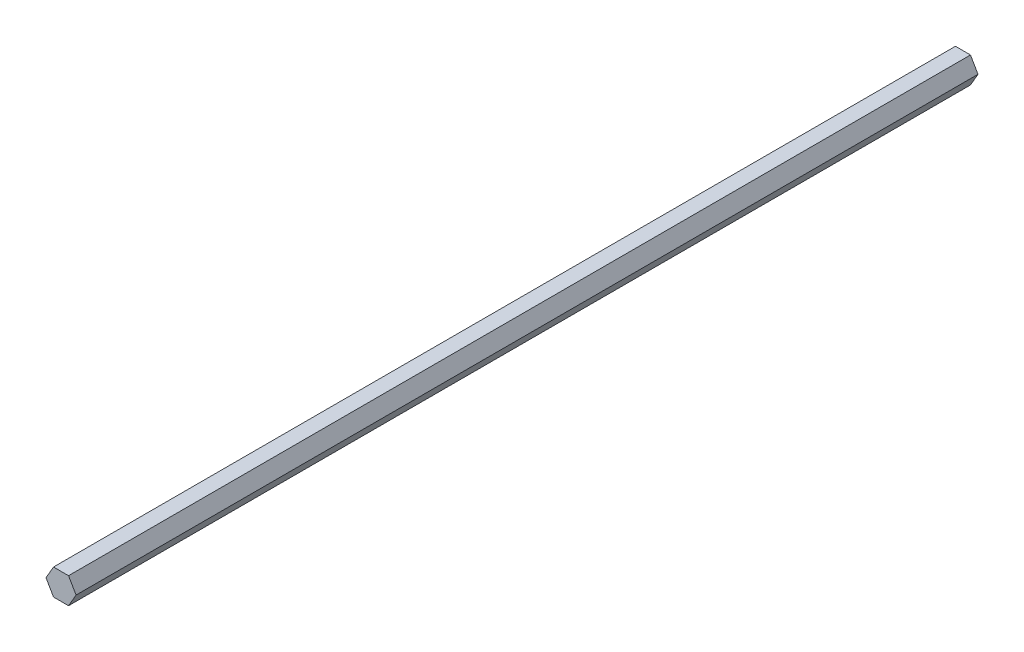
ISO-10303-21;
HEADER;
FILE_DESCRIPTION(('STEP AP214'),'2;1');
FILE_NAME('part.step','',(''),(''),'','','');
FILE_SCHEMA(('AUTOMOTIVE_DESIGN { 1 0 10303 214 1 1 1 1 }'));
ENDSEC;
DATA;
#1=APPLICATION_CONTEXT('core data for automotive mechanical design processes');
#2=APPLICATION_PROTOCOL_DEFINITION('international standard','automotive_design',2000,#1);
#3=PRODUCT_CONTEXT('',#1,'mechanical');
#4=PRODUCT('Part','Part','',(#3));
#5=PRODUCT_RELATED_PRODUCT_CATEGORY('part','',(#4));
#6=PRODUCT_DEFINITION_FORMATION('','',#4);
#7=PRODUCT_DEFINITION_CONTEXT('part definition',#1,'design');
#8=PRODUCT_DEFINITION('design','',#6,#7);
#9=PRODUCT_DEFINITION_SHAPE('','',#8);
#10=(LENGTH_UNIT() NAMED_UNIT(*) SI_UNIT(.MILLI.,.METRE.));
#11=(NAMED_UNIT(*) PLANE_ANGLE_UNIT() SI_UNIT($,.RADIAN.));
#12=(NAMED_UNIT(*) SI_UNIT($,.STERADIAN.) SOLID_ANGLE_UNIT());
#13=UNCERTAINTY_MEASURE_WITH_UNIT(LENGTH_MEASURE(1.E-05),#10,'distance_accuracy_value','');
#14=(GEOMETRIC_REPRESENTATION_CONTEXT(3) GLOBAL_UNCERTAINTY_ASSIGNED_CONTEXT((#13)) GLOBAL_UNIT_ASSIGNED_CONTEXT((#10,
#11,#12)) REPRESENTATION_CONTEXT('',''));
#15=CARTESIAN_POINT('',(0.,0.,0.));
#16=DIRECTION('',(0.,0.,1.));
#17=DIRECTION('',(1.,0.,0.));
#18=AXIS2_PLACEMENT_3D('',#15,#16,#17);
#19=CARTESIAN_POINT('',(-1.83308710467706,3.175,220.));
#20=DIRECTION('',(0.866025403784439,-0.5,0.));
#21=DIRECTION('',(0.5,0.866025403784439,0.));
#22=AXIS2_PLACEMENT_3D('',#19,#20,#21);
#23=PLANE('',#22);
#24=DIRECTION('',(-0.5,-0.866025403784439,0.));
#25=VECTOR('',#24,1.);
#26=CARTESIAN_POINT('',(-1.83308710467706,3.175,0.));
#27=LINE('',#26,#25);
#28=CARTESIAN_POINT('',(-1.83308710467706,3.175,0.));
#29=VERTEX_POINT('',#28);
#30=CARTESIAN_POINT('',(-3.66617420935412,0.,0.));
#31=VERTEX_POINT('',#30);
#32=EDGE_CURVE('E126',#29,#31,#27,.T.);
#33=ORIENTED_EDGE('',*,*,#32,.T.);
#34=DIRECTION('',(0.,0.,-1.));
#35=VECTOR('',#34,1.);
#36=CARTESIAN_POINT('',(-3.66617420935412,0.,220.));
#37=LINE('',#36,#35);
#38=CARTESIAN_POINT('',(-3.66617420935412,0.,220.));
#39=VERTEX_POINT('',#38);
#40=EDGE_CURVE('E11',#39,#31,#37,.T.);
#41=ORIENTED_EDGE('',*,*,#40,.F.);
#42=DIRECTION('',(-0.5,-0.866025403784439,0.));
#43=VECTOR('',#42,1.);
#44=CARTESIAN_POINT('',(-1.83308710467706,3.175,220.));
#45=LINE('',#44,#43);
#46=CARTESIAN_POINT('',(-1.83308710467706,3.175,220.));
#47=VERTEX_POINT('',#46);
#48=EDGE_CURVE('E136',#47,#39,#45,.T.);
#49=ORIENTED_EDGE('',*,*,#48,.F.);
#50=DIRECTION('',(0.,0.,-1.));
#51=VECTOR('',#50,1.);
#52=CARTESIAN_POINT('',(-1.83308710467706,3.175,220.));
#53=LINE('',#52,#51);
#54=EDGE_CURVE('E122',#47,#29,#53,.T.);
#55=ORIENTED_EDGE('',*,*,#54,.T.);
#56=EDGE_LOOP('',(#33,#41,#49,#55));
#57=FACE_BOUND('',#56,.T.);
#58=ADVANCED_FACE('F42',(#57),#23,.F.);
#59=CARTESIAN_POINT('',(-3.66617420935412,0.,220.));
#60=DIRECTION('',(0.866025403784438,0.5,0.));
#61=DIRECTION('',(-0.5,0.866025403784439,0.));
#62=AXIS2_PLACEMENT_3D('',#59,#60,#61);
#63=PLANE('',#62);
#64=DIRECTION('',(0.5,-0.866025403784438,0.));
#65=VECTOR('',#64,1.);
#66=CARTESIAN_POINT('',(-3.66617420935412,0.,0.));
#67=LINE('',#66,#65);
#68=CARTESIAN_POINT('',(-1.83308710467706,-3.175,0.));
#69=VERTEX_POINT('',#68);
#70=EDGE_CURVE('E129',#31,#69,#67,.T.);
#71=ORIENTED_EDGE('',*,*,#70,.T.);
#72=DIRECTION('',(0.,0.,-1.));
#73=VECTOR('',#72,1.);
#74=CARTESIAN_POINT('',(-1.83308710467706,-3.175,220.));
#75=LINE('',#74,#73);
#76=CARTESIAN_POINT('',(-1.83308710467706,-3.175,220.));
#77=VERTEX_POINT('',#76);
#78=EDGE_CURVE('E50',#77,#69,#75,.T.);
#79=ORIENTED_EDGE('',*,*,#78,.F.);
#80=DIRECTION('',(0.5,-0.866025403784438,0.));
#81=VECTOR('',#80,1.);
#82=CARTESIAN_POINT('',(-3.66617420935412,0.,220.));
#83=LINE('',#82,#81);
#84=EDGE_CURVE('E95',#39,#77,#83,.T.);
#85=ORIENTED_EDGE('',*,*,#84,.F.);
#86=ORIENTED_EDGE('',*,*,#40,.T.);
#87=EDGE_LOOP('',(#71,#79,#85,#86));
#88=FACE_BOUND('',#87,.T.);
#89=ADVANCED_FACE('F160',(#88),#63,.F.);
#90=CARTESIAN_POINT('',(-1.83308710467706,-3.175,220.));
#91=DIRECTION('',(0.,1.,0.));
#92=DIRECTION('',(-1.,0.,0.));
#93=AXIS2_PLACEMENT_3D('',#90,#91,#92);
#94=PLANE('',#93);
#95=DIRECTION('',(1.,0.,0.));
#96=VECTOR('',#95,1.);
#97=CARTESIAN_POINT('',(-1.83308710467706,-3.175,0.));
#98=LINE('',#97,#96);
#99=CARTESIAN_POINT('',(1.83308710467706,-3.175,0.));
#100=VERTEX_POINT('',#99);
#101=EDGE_CURVE('E131',#69,#100,#98,.T.);
#102=ORIENTED_EDGE('',*,*,#101,.T.);
#103=DIRECTION('',(0.,0.,-1.));
#104=VECTOR('',#103,1.);
#105=CARTESIAN_POINT('',(1.83308710467706,-3.175,220.));
#106=LINE('',#105,#104);
#107=CARTESIAN_POINT('',(1.83308710467706,-3.175,220.));
#108=VERTEX_POINT('',#107);
#109=EDGE_CURVE('E117',#108,#100,#106,.T.);
#110=ORIENTED_EDGE('',*,*,#109,.F.);
#111=DIRECTION('',(1.,0.,0.));
#112=VECTOR('',#111,1.);
#113=CARTESIAN_POINT('',(-1.83308710467706,-3.175,220.));
#114=LINE('',#113,#112);
#115=EDGE_CURVE('E108',#77,#108,#114,.T.);
#116=ORIENTED_EDGE('',*,*,#115,.F.);
#117=ORIENTED_EDGE('',*,*,#78,.T.);
#118=EDGE_LOOP('',(#102,#110,#116,#117));
#119=FACE_BOUND('',#118,.T.);
#120=ADVANCED_FACE('F142',(#119),#94,.F.);
#121=CARTESIAN_POINT('',(1.83308710467706,-3.175,220.));
#122=DIRECTION('',(-0.866025403784439,0.5,0.));
#123=DIRECTION('',(-0.5,-0.866025403784439,0.));
#124=AXIS2_PLACEMENT_3D('',#121,#122,#123);
#125=PLANE('',#124);
#126=DIRECTION('',(0.5,0.866025403784439,0.));
#127=VECTOR('',#126,1.);
#128=CARTESIAN_POINT('',(1.83308710467706,-3.175,0.));
#129=LINE('',#128,#127);
#130=CARTESIAN_POINT('',(3.66617420935412,0.,0.));
#131=VERTEX_POINT('',#130);
#132=EDGE_CURVE('E116',#100,#131,#129,.T.);
#133=ORIENTED_EDGE('',*,*,#132,.T.);
#134=DIRECTION('',(0.,0.,-1.));
#135=VECTOR('',#134,1.);
#136=CARTESIAN_POINT('',(3.66617420935412,0.,220.));
#137=LINE('',#136,#135);
#138=CARTESIAN_POINT('',(3.66617420935412,0.,220.));
#139=VERTEX_POINT('',#138);
#140=EDGE_CURVE('E113',#139,#131,#137,.T.);
#141=ORIENTED_EDGE('',*,*,#140,.F.);
#142=DIRECTION('',(0.5,0.866025403784439,0.));
#143=VECTOR('',#142,1.);
#144=CARTESIAN_POINT('',(1.83308710467706,-3.175,220.));
#145=LINE('',#144,#143);
#146=EDGE_CURVE('E102',#108,#139,#145,.T.);
#147=ORIENTED_EDGE('',*,*,#146,.F.);
#148=ORIENTED_EDGE('',*,*,#109,.T.);
#149=EDGE_LOOP('',(#133,#141,#147,#148));
#150=FACE_BOUND('',#149,.T.);
#151=ADVANCED_FACE('F114',(#150),#125,.F.);
#152=CARTESIAN_POINT('',(3.66617420935412,0.,220.));
#153=DIRECTION('',(-0.866025403784438,-0.5,0.));
#154=DIRECTION('',(0.500000000000001,-0.866025403784438,0.));
#155=AXIS2_PLACEMENT_3D('',#152,#153,#154);
#156=PLANE('',#155);
#157=DIRECTION('',(-0.500000000000001,0.866025403784438,0.));
#158=VECTOR('',#157,1.);
#159=CARTESIAN_POINT('',(3.66617420935412,0.,0.));
#160=LINE('',#159,#158);
#161=CARTESIAN_POINT('',(1.83308710467706,3.175,0.));
#162=VERTEX_POINT('',#161);
#163=EDGE_CURVE('E81',#131,#162,#160,.T.);
#164=ORIENTED_EDGE('',*,*,#163,.T.);
#165=DIRECTION('',(0.,0.,-1.));
#166=VECTOR('',#165,1.);
#167=CARTESIAN_POINT('',(1.83308710467706,3.175,220.));
#168=LINE('',#167,#166);
#169=CARTESIAN_POINT('',(1.83308710467706,3.175,220.));
#170=VERTEX_POINT('',#169);
#171=EDGE_CURVE('E118',#170,#162,#168,.T.);
#172=ORIENTED_EDGE('',*,*,#171,.F.);
#173=DIRECTION('',(-0.500000000000001,0.866025403784438,0.));
#174=VECTOR('',#173,1.);
#175=CARTESIAN_POINT('',(3.66617420935412,0.,220.));
#176=LINE('',#175,#174);
#177=EDGE_CURVE('E106',#139,#170,#176,.T.);
#178=ORIENTED_EDGE('',*,*,#177,.F.);
#179=ORIENTED_EDGE('',*,*,#140,.T.);
#180=EDGE_LOOP('',(#164,#172,#178,#179));
#181=FACE_BOUND('',#180,.T.);
#182=ADVANCED_FACE('F120',(#181),#156,.F.);
#183=CARTESIAN_POINT('',(1.83308710467706,3.175,220.));
#184=DIRECTION('',(0.,-1.,0.));
#185=DIRECTION('',(1.,0.,0.));
#186=AXIS2_PLACEMENT_3D('',#183,#184,#185);
#187=PLANE('',#186);
#188=DIRECTION('',(-1.,0.,0.));
#189=VECTOR('',#188,1.);
#190=CARTESIAN_POINT('',(1.83308710467706,3.175,0.));
#191=LINE('',#190,#189);
#192=EDGE_CURVE('E87',#162,#29,#191,.T.);
#193=ORIENTED_EDGE('',*,*,#192,.T.);
#194=ORIENTED_EDGE('',*,*,#54,.F.);
#195=DIRECTION('',(-1.,0.,0.));
#196=VECTOR('',#195,1.);
#197=CARTESIAN_POINT('',(1.83308710467706,3.175,220.));
#198=LINE('',#197,#196);
#199=EDGE_CURVE('E58',#170,#47,#198,.T.);
#200=ORIENTED_EDGE('',*,*,#199,.F.);
#201=ORIENTED_EDGE('',*,*,#171,.T.);
#202=EDGE_LOOP('',(#193,#194,#200,#201));
#203=FACE_BOUND('',#202,.T.);
#204=ADVANCED_FACE('F149',(#203),#187,.F.);
#205=CARTESIAN_POINT('',(0.,0.,220.));
#206=DIRECTION('',(0.,0.,1.));
#207=DIRECTION('',(1.,0.,0.));
#208=AXIS2_PLACEMENT_3D('',#205,#206,#207);
#209=PLANE('',#208);
#210=ORIENTED_EDGE('',*,*,#48,.T.);
#211=ORIENTED_EDGE('',*,*,#84,.T.);
#212=ORIENTED_EDGE('',*,*,#115,.T.);
#213=ORIENTED_EDGE('',*,*,#146,.T.);
#214=ORIENTED_EDGE('',*,*,#177,.T.);
#215=ORIENTED_EDGE('',*,*,#199,.T.);
#216=EDGE_LOOP('',(#210,#211,#212,#213,#214,#215));
#217=FACE_BOUND('',#216,.T.);
#218=ADVANCED_FACE('F104',(#217),#209,.T.);
#219=CARTESIAN_POINT('',(0.,0.,0.));
#220=DIRECTION('',(0.,0.,1.));
#221=DIRECTION('',(1.,0.,0.));
#222=AXIS2_PLACEMENT_3D('',#219,#220,#221);
#223=PLANE('',#222);
#224=ORIENTED_EDGE('',*,*,#32,.F.);
#225=ORIENTED_EDGE('',*,*,#192,.F.);
#226=ORIENTED_EDGE('',*,*,#163,.F.);
#227=ORIENTED_EDGE('',*,*,#132,.F.);
#228=ORIENTED_EDGE('',*,*,#101,.F.);
#229=ORIENTED_EDGE('',*,*,#70,.F.);
#230=EDGE_LOOP('',(#224,#225,#226,#227,#228,#229));
#231=FACE_BOUND('',#230,.T.);
#232=ADVANCED_FACE('F145',(#231),#223,.F.);
#233=CLOSED_SHELL('',(#58,#89,#120,#151,#182,#204,#218,#232));
#234=MANIFOLD_SOLID_BREP('B2',#233);
#235=ADVANCED_BREP_SHAPE_REPRESENTATION('',(#18,#234),#14);
#236=SHAPE_DEFINITION_REPRESENTATION(#9,#235);
ENDSEC;
END-ISO-10303-21;
